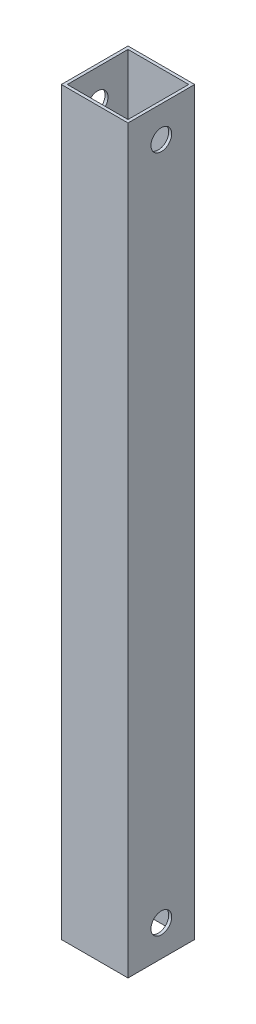
ISO-10303-21;
HEADER;
FILE_DESCRIPTION(('STEP AP214'),'2;1');
FILE_NAME('part.step','',(''),(''),'','','');
FILE_SCHEMA(('AUTOMOTIVE_DESIGN { 1 0 10303 214 1 1 1 1 }'));
ENDSEC;
DATA;
#1=APPLICATION_CONTEXT('core data for automotive mechanical design processes');
#2=APPLICATION_PROTOCOL_DEFINITION('international standard','automotive_design',2000,#1);
#3=PRODUCT_CONTEXT('',#1,'mechanical');
#4=PRODUCT('Part','Part','',(#3));
#5=PRODUCT_RELATED_PRODUCT_CATEGORY('part','',(#4));
#6=PRODUCT_DEFINITION_FORMATION('','',#4);
#7=PRODUCT_DEFINITION_CONTEXT('part definition',#1,'design');
#8=PRODUCT_DEFINITION('design','',#6,#7);
#9=PRODUCT_DEFINITION_SHAPE('','',#8);
#10=(LENGTH_UNIT() NAMED_UNIT(*) SI_UNIT(.MILLI.,.METRE.));
#11=(NAMED_UNIT(*) PLANE_ANGLE_UNIT() SI_UNIT($,.RADIAN.));
#12=(NAMED_UNIT(*) SI_UNIT($,.STERADIAN.) SOLID_ANGLE_UNIT());
#13=UNCERTAINTY_MEASURE_WITH_UNIT(LENGTH_MEASURE(1.E-05),#10,'distance_accuracy_value','');
#14=(GEOMETRIC_REPRESENTATION_CONTEXT(3) GLOBAL_UNCERTAINTY_ASSIGNED_CONTEXT((#13)) GLOBAL_UNIT_ASSIGNED_CONTEXT((#10,
#11,#12)) REPRESENTATION_CONTEXT('',''));
#15=CARTESIAN_POINT('',(0.,0.,0.));
#16=DIRECTION('',(0.,0.,1.));
#17=DIRECTION('',(1.,0.,0.));
#18=AXIS2_PLACEMENT_3D('',#15,#16,#17);
#19=CARTESIAN_POINT('',(0.,500.,0.));
#20=DIRECTION('',(1.,0.,0.));
#21=DIRECTION('',(0.,0.,-1.));
#22=AXIS2_PLACEMENT_3D('',#19,#20,#21);
#23=PLANE('',#22);
#24=CARTESIAN_POINT('',(0.,479.,-22.5));
#25=DIRECTION('',(1.,0.,0.));
#26=DIRECTION('',(0.,0.,-1.));
#27=AXIS2_PLACEMENT_3D('',#24,#25,#26);
#28=CIRCLE('',#27,7.);
#29=CARTESIAN_POINT('',(0.,479.,-29.5));
#30=VERTEX_POINT('',#29);
#31=EDGE_CURVE('E175',#30,#30,#28,.T.);
#32=ORIENTED_EDGE('',*,*,#31,.T.);
#33=EDGE_LOOP('',(#32));
#34=FACE_BOUND('',#33,.T.);
#35=CARTESIAN_POINT('',(0.,21.,-22.5));
#36=DIRECTION('',(1.,0.,0.));
#37=DIRECTION('',(0.,0.,-1.));
#38=AXIS2_PLACEMENT_3D('',#35,#36,#37);
#39=CIRCLE('',#38,7.);
#40=CARTESIAN_POINT('',(0.,21.,-29.5));
#41=VERTEX_POINT('',#40);
#42=EDGE_CURVE('E190',#41,#41,#39,.T.);
#43=ORIENTED_EDGE('',*,*,#42,.T.);
#44=EDGE_LOOP('',(#43));
#45=FACE_BOUND('',#44,.T.);
#46=DIRECTION('',(0.,0.,1.));
#47=VECTOR('',#46,1.);
#48=CARTESIAN_POINT('',(0.,0.,0.));
#49=LINE('',#48,#47);
#50=CARTESIAN_POINT('',(0.,0.,-45.));
#51=VERTEX_POINT('',#50);
#52=CARTESIAN_POINT('',(0.,0.,0.));
#53=VERTEX_POINT('',#52);
#54=EDGE_CURVE('E144',#51,#53,#49,.T.);
#55=ORIENTED_EDGE('',*,*,#54,.T.);
#56=DIRECTION('',(0.,-1.,0.));
#57=VECTOR('',#56,1.);
#58=CARTESIAN_POINT('',(0.,500.,0.));
#59=LINE('',#58,#57);
#60=CARTESIAN_POINT('',(0.,500.,0.));
#61=VERTEX_POINT('',#60);
#62=EDGE_CURVE('E11',#61,#53,#59,.T.);
#63=ORIENTED_EDGE('',*,*,#62,.F.);
#64=DIRECTION('',(0.,0.,1.));
#65=VECTOR('',#64,1.);
#66=CARTESIAN_POINT('',(0.,500.,0.));
#67=LINE('',#66,#65);
#68=CARTESIAN_POINT('',(0.,500.,-45.));
#69=VERTEX_POINT('',#68);
#70=EDGE_CURVE('E148',#69,#61,#67,.T.);
#71=ORIENTED_EDGE('',*,*,#70,.F.);
#72=DIRECTION('',(0.,-1.,0.));
#73=VECTOR('',#72,1.);
#74=CARTESIAN_POINT('',(0.,500.,-45.));
#75=LINE('',#74,#73);
#76=EDGE_CURVE('E158',#69,#51,#75,.T.);
#77=ORIENTED_EDGE('',*,*,#76,.T.);
#78=EDGE_LOOP('',(#55,#63,#71,#77));
#79=FACE_BOUND('',#78,.T.);
#80=ADVANCED_FACE('F42',(#34,#45,#79),#23,.F.);
#81=CARTESIAN_POINT('',(0.,500.,0.));
#82=DIRECTION('',(0.,0.,-1.));
#83=DIRECTION('',(-1.,0.,0.));
#84=AXIS2_PLACEMENT_3D('',#81,#82,#83);
#85=PLANE('',#84);
#86=DIRECTION('',(1.,0.,0.));
#87=VECTOR('',#86,1.);
#88=CARTESIAN_POINT('',(0.,0.,0.));
#89=LINE('',#88,#87);
#90=CARTESIAN_POINT('',(45.,0.,0.));
#91=VERTEX_POINT('',#90);
#92=EDGE_CURVE('E161',#53,#91,#89,.T.);
#93=ORIENTED_EDGE('',*,*,#92,.T.);
#94=DIRECTION('',(0.,-1.,0.));
#95=VECTOR('',#94,1.);
#96=CARTESIAN_POINT('',(45.,500.,0.));
#97=LINE('',#96,#95);
#98=CARTESIAN_POINT('',(45.,500.,0.));
#99=VERTEX_POINT('',#98);
#100=EDGE_CURVE('E50',#99,#91,#97,.T.);
#101=ORIENTED_EDGE('',*,*,#100,.F.);
#102=DIRECTION('',(1.,0.,0.));
#103=VECTOR('',#102,1.);
#104=CARTESIAN_POINT('',(0.,500.,0.));
#105=LINE('',#104,#103);
#106=EDGE_CURVE('E151',#61,#99,#105,.T.);
#107=ORIENTED_EDGE('',*,*,#106,.F.);
#108=ORIENTED_EDGE('',*,*,#62,.T.);
#109=EDGE_LOOP('',(#93,#101,#107,#108));
#110=FACE_BOUND('',#109,.T.);
#111=ADVANCED_FACE('F224',(#110),#85,.F.);
#112=CARTESIAN_POINT('',(45.,500.,0.));
#113=DIRECTION('',(-1.,0.,0.));
#114=DIRECTION('',(0.,0.,1.));
#115=AXIS2_PLACEMENT_3D('',#112,#113,#114);
#116=PLANE('',#115);
#117=CARTESIAN_POINT('',(45.,479.,-22.5));
#118=DIRECTION('',(1.,0.,0.));
#119=DIRECTION('',(0.,0.,-1.));
#120=AXIS2_PLACEMENT_3D('',#117,#118,#119);
#121=CIRCLE('',#120,7.);
#122=CARTESIAN_POINT('',(45.,479.,-29.5));
#123=VERTEX_POINT('',#122);
#124=EDGE_CURVE('E180',#123,#123,#121,.T.);
#125=ORIENTED_EDGE('',*,*,#124,.F.);
#126=EDGE_LOOP('',(#125));
#127=FACE_BOUND('',#126,.T.);
#128=CARTESIAN_POINT('',(45.,21.,-22.5));
#129=DIRECTION('',(1.,0.,0.));
#130=DIRECTION('',(0.,0.,-1.));
#131=AXIS2_PLACEMENT_3D('',#128,#129,#130);
#132=CIRCLE('',#131,7.);
#133=CARTESIAN_POINT('',(45.,21.,-29.5));
#134=VERTEX_POINT('',#133);
#135=EDGE_CURVE('E185',#134,#134,#132,.T.);
#136=ORIENTED_EDGE('',*,*,#135,.F.);
#137=EDGE_LOOP('',(#136));
#138=FACE_BOUND('',#137,.T.);
#139=DIRECTION('',(0.,0.,-1.));
#140=VECTOR('',#139,1.);
#141=CARTESIAN_POINT('',(45.,0.,0.));
#142=LINE('',#141,#140);
#143=CARTESIAN_POINT('',(45.,0.,-45.));
#144=VERTEX_POINT('',#143);
#145=EDGE_CURVE('E163',#91,#144,#142,.T.);
#146=ORIENTED_EDGE('',*,*,#145,.T.);
#147=DIRECTION('',(0.,-1.,0.));
#148=VECTOR('',#147,1.);
#149=CARTESIAN_POINT('',(45.,500.,-45.));
#150=LINE('',#149,#148);
#151=CARTESIAN_POINT('',(45.,500.,-45.));
#152=VERTEX_POINT('',#151);
#153=EDGE_CURVE('E168',#152,#144,#150,.T.);
#154=ORIENTED_EDGE('',*,*,#153,.F.);
#155=DIRECTION('',(0.,0.,-1.));
#156=VECTOR('',#155,1.);
#157=CARTESIAN_POINT('',(45.,500.,0.));
#158=LINE('',#157,#156);
#159=EDGE_CURVE('E154',#99,#152,#158,.T.);
#160=ORIENTED_EDGE('',*,*,#159,.F.);
#161=ORIENTED_EDGE('',*,*,#100,.T.);
#162=EDGE_LOOP('',(#146,#154,#160,#161));
#163=FACE_BOUND('',#162,.T.);
#164=ADVANCED_FACE('F229',(#127,#138,#163),#116,.F.);
#165=CARTESIAN_POINT('',(0.,500.,-45.));
#166=DIRECTION('',(0.,0.,1.));
#167=DIRECTION('',(1.,0.,0.));
#168=AXIS2_PLACEMENT_3D('',#165,#166,#167);
#169=PLANE('',#168);
#170=DIRECTION('',(-1.,0.,0.));
#171=VECTOR('',#170,1.);
#172=CARTESIAN_POINT('',(0.,0.,-45.));
#173=LINE('',#172,#171);
#174=EDGE_CURVE('E152',#144,#51,#173,.T.);
#175=ORIENTED_EDGE('',*,*,#174,.T.);
#176=ORIENTED_EDGE('',*,*,#76,.F.);
#177=DIRECTION('',(-1.,0.,0.));
#178=VECTOR('',#177,1.);
#179=CARTESIAN_POINT('',(0.,500.,-45.));
#180=LINE('',#179,#178);
#181=EDGE_CURVE('E156',#152,#69,#180,.T.);
#182=ORIENTED_EDGE('',*,*,#181,.F.);
#183=ORIENTED_EDGE('',*,*,#153,.T.);
#184=EDGE_LOOP('',(#175,#176,#182,#183));
#185=FACE_BOUND('',#184,.T.);
#186=ADVANCED_FACE('F234',(#185),#169,.F.);
#187=CARTESIAN_POINT('',(0.,500.,0.));
#188=DIRECTION('',(0.,-1.,0.));
#189=DIRECTION('',(0.,0.,-1.));
#190=AXIS2_PLACEMENT_3D('',#187,#188,#189);
#191=PLANE('',#190);
#192=DIRECTION('',(1.,0.,0.));
#193=VECTOR('',#192,1.);
#194=CARTESIAN_POINT('',(2.00000000000001,500.,-2.));
#195=LINE('',#194,#193);
#196=CARTESIAN_POINT('',(2.00000000000001,500.,-2.));
#197=VERTEX_POINT('',#196);
#198=CARTESIAN_POINT('',(43.,500.,-2.));
#199=VERTEX_POINT('',#198);
#200=EDGE_CURVE('E138',#197,#199,#195,.T.);
#201=ORIENTED_EDGE('',*,*,#200,.F.);
#202=DIRECTION('',(0.,0.,1.));
#203=VECTOR('',#202,1.);
#204=CARTESIAN_POINT('',(2.,500.,-43.));
#205=LINE('',#204,#203);
#206=CARTESIAN_POINT('',(2.,500.,-43.));
#207=VERTEX_POINT('',#206);
#208=EDGE_CURVE('E58',#207,#197,#205,.T.);
#209=ORIENTED_EDGE('',*,*,#208,.F.);
#210=DIRECTION('',(-1.,0.,0.));
#211=VECTOR('',#210,1.);
#212=CARTESIAN_POINT('',(2.,500.,-43.));
#213=LINE('',#212,#211);
#214=CARTESIAN_POINT('',(43.,500.,-43.));
#215=VERTEX_POINT('',#214);
#216=EDGE_CURVE('E126',#215,#207,#213,.T.);
#217=ORIENTED_EDGE('',*,*,#216,.F.);
#218=DIRECTION('',(0.,0.,-1.));
#219=VECTOR('',#218,1.);
#220=CARTESIAN_POINT('',(43.,500.,-43.));
#221=LINE('',#220,#219);
#222=EDGE_CURVE('E129',#199,#215,#221,.T.);
#223=ORIENTED_EDGE('',*,*,#222,.F.);
#224=EDGE_LOOP('',(#201,#209,#217,#223));
#225=FACE_BOUND('',#224,.T.);
#226=ORIENTED_EDGE('',*,*,#70,.T.);
#227=ORIENTED_EDGE('',*,*,#106,.T.);
#228=ORIENTED_EDGE('',*,*,#159,.T.);
#229=ORIENTED_EDGE('',*,*,#181,.T.);
#230=EDGE_LOOP('',(#226,#227,#228,#229));
#231=FACE_BOUND('',#230,.T.);
#232=ADVANCED_FACE('F218',(#225,#231),#191,.F.);
#233=CARTESIAN_POINT('',(0.,0.,0.));
#234=DIRECTION('',(0.,-1.,0.));
#235=DIRECTION('',(0.,0.,-1.));
#236=AXIS2_PLACEMENT_3D('',#233,#234,#235);
#237=PLANE('',#236);
#238=DIRECTION('',(0.,0.,1.));
#239=VECTOR('',#238,1.);
#240=CARTESIAN_POINT('',(2.,0.,-43.));
#241=LINE('',#240,#239);
#242=CARTESIAN_POINT('',(2.,0.,-43.));
#243=VERTEX_POINT('',#242);
#244=CARTESIAN_POINT('',(2.00000000000001,0.,-2.));
#245=VERTEX_POINT('',#244);
#246=EDGE_CURVE('E110',#243,#245,#241,.T.);
#247=ORIENTED_EDGE('',*,*,#246,.T.);
#248=DIRECTION('',(1.,0.,0.));
#249=VECTOR('',#248,1.);
#250=CARTESIAN_POINT('',(2.00000000000001,0.,-2.));
#251=LINE('',#250,#249);
#252=CARTESIAN_POINT('',(43.,0.,-2.));
#253=VERTEX_POINT('',#252);
#254=EDGE_CURVE('E119',#245,#253,#251,.T.);
#255=ORIENTED_EDGE('',*,*,#254,.T.);
#256=DIRECTION('',(0.,0.,-1.));
#257=VECTOR('',#256,1.);
#258=CARTESIAN_POINT('',(43.,0.,-43.));
#259=LINE('',#258,#257);
#260=CARTESIAN_POINT('',(43.,0.,-43.));
#261=VERTEX_POINT('',#260);
#262=EDGE_CURVE('E66',#253,#261,#259,.T.);
#263=ORIENTED_EDGE('',*,*,#262,.T.);
#264=DIRECTION('',(-1.,0.,0.));
#265=VECTOR('',#264,1.);
#266=CARTESIAN_POINT('',(2.,0.,-43.));
#267=LINE('',#266,#265);
#268=EDGE_CURVE('E116',#261,#243,#267,.T.);
#269=ORIENTED_EDGE('',*,*,#268,.T.);
#270=EDGE_LOOP('',(#247,#255,#263,#269));
#271=FACE_BOUND('',#270,.T.);
#272=ORIENTED_EDGE('',*,*,#54,.F.);
#273=ORIENTED_EDGE('',*,*,#174,.F.);
#274=ORIENTED_EDGE('',*,*,#145,.F.);
#275=ORIENTED_EDGE('',*,*,#92,.F.);
#276=EDGE_LOOP('',(#272,#273,#274,#275));
#277=FACE_BOUND('',#276,.T.);
#278=ADVANCED_FACE('F123',(#271,#277),#237,.T.);
#279=CARTESIAN_POINT('',(2.,0.,-43.));
#280=DIRECTION('',(-1.,0.,0.));
#281=DIRECTION('',(0.,0.,1.));
#282=AXIS2_PLACEMENT_3D('',#279,#280,#281);
#283=PLANE('',#282);
#284=CARTESIAN_POINT('',(2.,479.,-22.5));
#285=DIRECTION('',(-1.,0.,0.));
#286=DIRECTION('',(0.,0.,1.));
#287=AXIS2_PLACEMENT_3D('',#284,#285,#286);
#288=CIRCLE('',#287,7.);
#289=CARTESIAN_POINT('',(2.,479.,-29.5));
#290=VERTEX_POINT('',#289);
#291=EDGE_CURVE('E132',#290,#290,#288,.T.);
#292=ORIENTED_EDGE('',*,*,#291,.T.);
#293=EDGE_LOOP('',(#292));
#294=FACE_BOUND('',#293,.T.);
#295=CARTESIAN_POINT('',(2.,21.,-22.5));
#296=DIRECTION('',(-1.,0.,0.));
#297=DIRECTION('',(0.,0.,1.));
#298=AXIS2_PLACEMENT_3D('',#295,#296,#297);
#299=CIRCLE('',#298,7.);
#300=CARTESIAN_POINT('',(2.,21.,-29.5));
#301=VERTEX_POINT('',#300);
#302=EDGE_CURVE('E174',#301,#301,#299,.T.);
#303=ORIENTED_EDGE('',*,*,#302,.T.);
#304=EDGE_LOOP('',(#303));
#305=FACE_BOUND('',#304,.T.);
#306=ORIENTED_EDGE('',*,*,#208,.T.);
#307=DIRECTION('',(0.,1.,0.));
#308=VECTOR('',#307,1.);
#309=CARTESIAN_POINT('',(2.00000000000001,0.,-2.));
#310=LINE('',#309,#308);
#311=EDGE_CURVE('E106',#245,#197,#310,.T.);
#312=ORIENTED_EDGE('',*,*,#311,.F.);
#313=ORIENTED_EDGE('',*,*,#246,.F.);
#314=DIRECTION('',(0.,1.,0.));
#315=VECTOR('',#314,1.);
#316=CARTESIAN_POINT('',(2.,0.,-43.));
#317=LINE('',#316,#315);
#318=EDGE_CURVE('E142',#243,#207,#317,.T.);
#319=ORIENTED_EDGE('',*,*,#318,.T.);
#320=EDGE_LOOP('',(#306,#312,#313,#319));
#321=FACE_BOUND('',#320,.T.);
#322=ADVANCED_FACE('F108',(#294,#305,#321),#283,.F.);
#323=CARTESIAN_POINT('',(2.,0.,-43.));
#324=DIRECTION('',(0.,0.,-1.));
#325=DIRECTION('',(-1.,0.,0.));
#326=AXIS2_PLACEMENT_3D('',#323,#324,#325);
#327=PLANE('',#326);
#328=ORIENTED_EDGE('',*,*,#216,.T.);
#329=ORIENTED_EDGE('',*,*,#318,.F.);
#330=ORIENTED_EDGE('',*,*,#268,.F.);
#331=DIRECTION('',(0.,1.,0.));
#332=VECTOR('',#331,1.);
#333=CARTESIAN_POINT('',(43.,0.,-43.));
#334=LINE('',#333,#332);
#335=EDGE_CURVE('E145',#261,#215,#334,.T.);
#336=ORIENTED_EDGE('',*,*,#335,.T.);
#337=EDGE_LOOP('',(#328,#329,#330,#336));
#338=FACE_BOUND('',#337,.T.);
#339=ADVANCED_FACE('F206',(#338),#327,.F.);
#340=CARTESIAN_POINT('',(43.,0.,-43.));
#341=DIRECTION('',(1.,0.,0.));
#342=DIRECTION('',(0.,0.,-1.));
#343=AXIS2_PLACEMENT_3D('',#340,#341,#342);
#344=PLANE('',#343);
#345=CARTESIAN_POINT('',(43.,479.,-22.5));
#346=DIRECTION('',(1.,0.,0.));
#347=DIRECTION('',(0.,0.,-1.));
#348=AXIS2_PLACEMENT_3D('',#345,#346,#347);
#349=CIRCLE('',#348,7.);
#350=CARTESIAN_POINT('',(43.,479.,-29.5));
#351=VERTEX_POINT('',#350);
#352=EDGE_CURVE('E45',#351,#351,#349,.T.);
#353=ORIENTED_EDGE('',*,*,#352,.T.);
#354=EDGE_LOOP('',(#353));
#355=FACE_BOUND('',#354,.T.);
#356=CARTESIAN_POINT('',(43.,21.,-22.5));
#357=DIRECTION('',(1.,0.,0.));
#358=DIRECTION('',(0.,0.,-1.));
#359=AXIS2_PLACEMENT_3D('',#356,#357,#358);
#360=CIRCLE('',#359,7.);
#361=CARTESIAN_POINT('',(43.,21.,-29.5));
#362=VERTEX_POINT('',#361);
#363=EDGE_CURVE('E172',#362,#362,#360,.T.);
#364=ORIENTED_EDGE('',*,*,#363,.T.);
#365=EDGE_LOOP('',(#364));
#366=FACE_BOUND('',#365,.T.);
#367=ORIENTED_EDGE('',*,*,#222,.T.);
#368=ORIENTED_EDGE('',*,*,#335,.F.);
#369=ORIENTED_EDGE('',*,*,#262,.F.);
#370=DIRECTION('',(0.,1.,0.));
#371=VECTOR('',#370,1.);
#372=CARTESIAN_POINT('',(43.,0.,-2.));
#373=LINE('',#372,#371);
#374=EDGE_CURVE('E115',#253,#199,#373,.T.);
#375=ORIENTED_EDGE('',*,*,#374,.T.);
#376=EDGE_LOOP('',(#367,#368,#369,#375));
#377=FACE_BOUND('',#376,.T.);
#378=ADVANCED_FACE('F214',(#355,#366,#377),#344,.F.);
#379=CARTESIAN_POINT('',(2.00000000000001,0.,-2.));
#380=DIRECTION('',(0.,0.,1.));
#381=DIRECTION('',(1.,0.,0.));
#382=AXIS2_PLACEMENT_3D('',#379,#380,#381);
#383=PLANE('',#382);
#384=ORIENTED_EDGE('',*,*,#200,.T.);
#385=ORIENTED_EDGE('',*,*,#374,.F.);
#386=ORIENTED_EDGE('',*,*,#254,.F.);
#387=ORIENTED_EDGE('',*,*,#311,.T.);
#388=EDGE_LOOP('',(#384,#385,#386,#387));
#389=FACE_BOUND('',#388,.T.);
#390=ADVANCED_FACE('F120',(#389),#383,.F.);
#391=CARTESIAN_POINT('',(0.,21.,-22.5));
#392=DIRECTION('',(1.,0.,0.));
#393=DIRECTION('',(0.,0.,-1.));
#394=AXIS2_PLACEMENT_3D('',#391,#392,#393);
#395=CYLINDRICAL_SURFACE('',#394,7.);
#396=CARTESIAN_POINT('',(45.,21.,-29.5));
#397=CARTESIAN_POINT('',(44.9791666666667,21.,-29.5));
#398=CARTESIAN_POINT('',(44.9583333333333,21.,-29.5));
#399=CARTESIAN_POINT('',(44.9166666666667,21.,-29.5));
#400=CARTESIAN_POINT('',(44.8958333333333,21.,-29.5));
#401=CARTESIAN_POINT('',(44.8541666666667,21.,-29.5));
#402=CARTESIAN_POINT('',(44.8333333333333,21.,-29.5));
#403=CARTESIAN_POINT('',(44.7916666666667,21.,-29.5));
#404=CARTESIAN_POINT('',(44.7708333333333,21.,-29.5));
#405=CARTESIAN_POINT('',(44.7291666666667,21.,-29.5));
#406=CARTESIAN_POINT('',(44.7083333333333,21.,-29.5));
#407=CARTESIAN_POINT('',(44.6666666666667,21.,-29.5));
#408=CARTESIAN_POINT('',(44.6458333333333,21.,-29.5));
#409=CARTESIAN_POINT('',(44.6041666666667,21.,-29.5));
#410=CARTESIAN_POINT('',(44.5833333333333,21.,-29.5));
#411=CARTESIAN_POINT('',(44.5416666666667,21.,-29.5));
#412=CARTESIAN_POINT('',(44.5208333333333,21.,-29.5));
#413=CARTESIAN_POINT('',(44.4791666666667,21.,-29.5));
#414=CARTESIAN_POINT('',(44.4583333333333,21.,-29.5));
#415=CARTESIAN_POINT('',(44.4166666666667,21.,-29.5));
#416=CARTESIAN_POINT('',(44.3958333333333,21.,-29.5));
#417=CARTESIAN_POINT('',(44.3541666666667,21.,-29.5));
#418=CARTESIAN_POINT('',(44.3333333333333,21.,-29.5));
#419=CARTESIAN_POINT('',(44.2916666666667,21.,-29.5));
#420=CARTESIAN_POINT('',(44.2708333333333,21.,-29.5));
#421=CARTESIAN_POINT('',(44.2291666666667,21.,-29.5));
#422=CARTESIAN_POINT('',(44.2083333333333,21.,-29.5));
#423=CARTESIAN_POINT('',(44.1666666666667,21.,-29.5));
#424=CARTESIAN_POINT('',(44.1458333333333,21.,-29.5));
#425=CARTESIAN_POINT('',(44.1041666666667,21.,-29.5));
#426=CARTESIAN_POINT('',(44.0833333333333,21.,-29.5));
#427=CARTESIAN_POINT('',(44.0416666666667,21.,-29.5));
#428=CARTESIAN_POINT('',(44.0208333333333,21.,-29.5));
#429=CARTESIAN_POINT('',(43.9791666666667,21.,-29.5));
#430=CARTESIAN_POINT('',(43.9583333333333,21.,-29.5));
#431=CARTESIAN_POINT('',(43.9166666666667,21.,-29.5));
#432=CARTESIAN_POINT('',(43.8958333333333,21.,-29.5));
#433=CARTESIAN_POINT('',(43.8541666666667,21.,-29.5));
#434=CARTESIAN_POINT('',(43.8333333333333,21.,-29.5));
#435=CARTESIAN_POINT('',(43.7916666666667,21.,-29.5));
#436=CARTESIAN_POINT('',(43.7708333333333,21.,-29.5));
#437=CARTESIAN_POINT('',(43.7291666666667,21.,-29.5));
#438=CARTESIAN_POINT('',(43.7083333333333,21.,-29.5));
#439=CARTESIAN_POINT('',(43.6666666666667,21.,-29.5));
#440=CARTESIAN_POINT('',(43.6458333333333,21.,-29.5));
#441=CARTESIAN_POINT('',(43.6041666666667,21.,-29.5));
#442=CARTESIAN_POINT('',(43.5833333333333,21.,-29.5));
#443=CARTESIAN_POINT('',(43.5416666666667,21.,-29.5));
#444=CARTESIAN_POINT('',(43.5208333333333,21.,-29.5));
#445=CARTESIAN_POINT('',(43.4791666666667,21.,-29.5));
#446=CARTESIAN_POINT('',(43.4583333333333,21.,-29.5));
#447=CARTESIAN_POINT('',(43.4166666666667,21.,-29.5));
#448=CARTESIAN_POINT('',(43.3958333333333,21.,-29.5));
#449=CARTESIAN_POINT('',(43.3541666666667,21.,-29.5));
#450=CARTESIAN_POINT('',(43.3333333333333,21.,-29.5));
#451=CARTESIAN_POINT('',(43.2916666666667,21.,-29.5));
#452=CARTESIAN_POINT('',(43.2708333333333,21.,-29.5));
#453=CARTESIAN_POINT('',(43.2291666666667,21.,-29.5));
#454=CARTESIAN_POINT('',(43.2083333333333,21.,-29.5));
#455=CARTESIAN_POINT('',(43.1666666666667,21.,-29.5));
#456=CARTESIAN_POINT('',(43.1458333333333,21.,-29.5));
#457=CARTESIAN_POINT('',(43.1041666666667,21.,-29.5));
#458=CARTESIAN_POINT('',(43.0833333333333,21.,-29.5));
#459=CARTESIAN_POINT('',(43.0416666666667,21.,-29.5));
#460=CARTESIAN_POINT('',(43.0208333333333,21.,-29.5));
#461=CARTESIAN_POINT('',(43.,21.,-29.5));
#462=B_SPLINE_CURVE_WITH_KNOTS('',3,(#396,#397,#398,#399,#400,#401,#402,#403,#404,#405,#406,
#407,#408,#409,#410,#411,#412,#413,#414,#415,#416,#417,#418,#419,#420,#421,#422,#423,#424,#425,
#426,#427,#428,#429,#430,#431,#432,#433,#434,#435,#436,#437,#438,#439,#440,#441,#442,#443,#444,
#445,#446,#447,#448,#449,#450,#451,#452,#453,#454,#455,#456,#457,#458,#459,#460,#461),
.UNSPECIFIED.,.F.,.F.,(4,2,2,2,2,2,2,2,2,2,2,2,2,2,2,2,2,2,2,2,2,2,2,2,2,2,2,2,2,2,2,2,4),(0.,
0.0625000000000001,0.125,0.1875,0.25,0.3125,0.375,0.4375,0.5,0.562499999999994,
0.624999999999994,0.687499999999994,0.749999999999994,0.812499999999994,0.874999999999994,
0.937499999999994,0.999999999999994,1.06249999999999,1.12499999999999,1.18749999999999,
1.24999999999999,1.31249999999999,1.37499999999999,1.43749999999999,1.49999999999999,
1.56249999999999,1.62499999999999,1.68749999999999,1.74999999999999,1.81249999999999,
1.87499999999999,1.93749999999999,1.99999999999999),.UNSPECIFIED.);
#463=EDGE_CURVE('BSEAM202',#134,#362,#462,.T.);
#464=ORIENTED_EDGE('',*,*,#135,.T.);
#465=ORIENTED_EDGE('',*,*,#363,.F.);
#466=ORIENTED_EDGE('',*,*,#463,.T.);
#467=ORIENTED_EDGE('',*,*,#463,.F.);
#468=EDGE_LOOP('',(#464,#466,#465,#467));
#469=FACE_BOUND('',#468,.T.);
#470=ADVANCED_FACE('F202',(#469),#395,.F.);
#471=CARTESIAN_POINT('',(0.,479.,-22.5));
#472=DIRECTION('',(1.,0.,0.));
#473=DIRECTION('',(0.,0.,-1.));
#474=AXIS2_PLACEMENT_3D('',#471,#472,#473);
#475=CYLINDRICAL_SURFACE('',#474,7.);
#476=CARTESIAN_POINT('',(45.,479.,-29.5));
#477=CARTESIAN_POINT('',(44.9791666666667,479.,-29.5));
#478=CARTESIAN_POINT('',(44.9583333333333,479.,-29.5));
#479=CARTESIAN_POINT('',(44.9166666666667,479.,-29.5));
#480=CARTESIAN_POINT('',(44.8958333333333,479.,-29.5));
#481=CARTESIAN_POINT('',(44.8541666666667,479.,-29.5));
#482=CARTESIAN_POINT('',(44.8333333333333,479.,-29.5));
#483=CARTESIAN_POINT('',(44.7916666666667,479.,-29.5));
#484=CARTESIAN_POINT('',(44.7708333333333,479.,-29.5));
#485=CARTESIAN_POINT('',(44.7291666666667,479.,-29.5));
#486=CARTESIAN_POINT('',(44.7083333333333,479.,-29.5));
#487=CARTESIAN_POINT('',(44.6666666666667,479.,-29.5));
#488=CARTESIAN_POINT('',(44.6458333333333,479.,-29.5));
#489=CARTESIAN_POINT('',(44.6041666666667,479.,-29.5));
#490=CARTESIAN_POINT('',(44.5833333333333,479.,-29.5));
#491=CARTESIAN_POINT('',(44.5416666666667,479.,-29.5));
#492=CARTESIAN_POINT('',(44.5208333333333,479.,-29.5));
#493=CARTESIAN_POINT('',(44.4791666666667,479.,-29.5));
#494=CARTESIAN_POINT('',(44.4583333333333,479.,-29.5));
#495=CARTESIAN_POINT('',(44.4166666666667,479.,-29.5));
#496=CARTESIAN_POINT('',(44.3958333333333,479.,-29.5));
#497=CARTESIAN_POINT('',(44.3541666666667,479.,-29.5));
#498=CARTESIAN_POINT('',(44.3333333333333,479.,-29.5));
#499=CARTESIAN_POINT('',(44.2916666666667,479.,-29.5));
#500=CARTESIAN_POINT('',(44.2708333333333,479.,-29.5));
#501=CARTESIAN_POINT('',(44.2291666666667,479.,-29.5));
#502=CARTESIAN_POINT('',(44.2083333333333,479.,-29.5));
#503=CARTESIAN_POINT('',(44.1666666666667,479.,-29.5));
#504=CARTESIAN_POINT('',(44.1458333333333,479.,-29.5));
#505=CARTESIAN_POINT('',(44.1041666666667,479.,-29.5));
#506=CARTESIAN_POINT('',(44.0833333333333,479.,-29.5));
#507=CARTESIAN_POINT('',(44.0416666666667,479.,-29.5));
#508=CARTESIAN_POINT('',(44.0208333333333,479.,-29.5));
#509=CARTESIAN_POINT('',(43.9791666666667,479.,-29.5));
#510=CARTESIAN_POINT('',(43.9583333333333,479.,-29.5));
#511=CARTESIAN_POINT('',(43.9166666666667,479.,-29.5));
#512=CARTESIAN_POINT('',(43.8958333333333,479.,-29.5));
#513=CARTESIAN_POINT('',(43.8541666666667,479.,-29.5));
#514=CARTESIAN_POINT('',(43.8333333333333,479.,-29.5));
#515=CARTESIAN_POINT('',(43.7916666666667,479.,-29.5));
#516=CARTESIAN_POINT('',(43.7708333333333,479.,-29.5));
#517=CARTESIAN_POINT('',(43.7291666666667,479.,-29.5));
#518=CARTESIAN_POINT('',(43.7083333333333,479.,-29.5));
#519=CARTESIAN_POINT('',(43.6666666666667,479.,-29.5));
#520=CARTESIAN_POINT('',(43.6458333333333,479.,-29.5));
#521=CARTESIAN_POINT('',(43.6041666666667,479.,-29.5));
#522=CARTESIAN_POINT('',(43.5833333333333,479.,-29.5));
#523=CARTESIAN_POINT('',(43.5416666666667,479.,-29.5));
#524=CARTESIAN_POINT('',(43.5208333333333,479.,-29.5));
#525=CARTESIAN_POINT('',(43.4791666666667,479.,-29.5));
#526=CARTESIAN_POINT('',(43.4583333333333,479.,-29.5));
#527=CARTESIAN_POINT('',(43.4166666666667,479.,-29.5));
#528=CARTESIAN_POINT('',(43.3958333333333,479.,-29.5));
#529=CARTESIAN_POINT('',(43.3541666666667,479.,-29.5));
#530=CARTESIAN_POINT('',(43.3333333333333,479.,-29.5));
#531=CARTESIAN_POINT('',(43.2916666666667,479.,-29.5));
#532=CARTESIAN_POINT('',(43.2708333333333,479.,-29.5));
#533=CARTESIAN_POINT('',(43.2291666666667,479.,-29.5));
#534=CARTESIAN_POINT('',(43.2083333333333,479.,-29.5));
#535=CARTESIAN_POINT('',(43.1666666666667,479.,-29.5));
#536=CARTESIAN_POINT('',(43.1458333333333,479.,-29.5));
#537=CARTESIAN_POINT('',(43.1041666666667,479.,-29.5));
#538=CARTESIAN_POINT('',(43.0833333333333,479.,-29.5));
#539=CARTESIAN_POINT('',(43.0416666666667,479.,-29.5));
#540=CARTESIAN_POINT('',(43.0208333333333,479.,-29.5));
#541=CARTESIAN_POINT('',(43.,479.,-29.5));
#542=B_SPLINE_CURVE_WITH_KNOTS('',3,(#476,#477,#478,#479,#480,#481,#482,#483,#484,#485,#486,
#487,#488,#489,#490,#491,#492,#493,#494,#495,#496,#497,#498,#499,#500,#501,#502,#503,#504,#505,
#506,#507,#508,#509,#510,#511,#512,#513,#514,#515,#516,#517,#518,#519,#520,#521,#522,#523,#524,
#525,#526,#527,#528,#529,#530,#531,#532,#533,#534,#535,#536,#537,#538,#539,#540,#541),
.UNSPECIFIED.,.F.,.F.,(4,2,2,2,2,2,2,2,2,2,2,2,2,2,2,2,2,2,2,2,2,2,2,2,2,2,2,2,2,2,2,2,4),(0.,
0.0625000000000001,0.125,0.1875,0.25,0.3125,0.375,0.4375,0.5,0.562499999999994,
0.624999999999994,0.687499999999994,0.749999999999994,0.812499999999994,0.874999999999994,
0.937499999999994,0.999999999999994,1.06249999999999,1.12499999999999,1.18749999999999,
1.24999999999999,1.31249999999999,1.37499999999999,1.43749999999999,1.49999999999999,
1.56249999999999,1.62499999999999,1.68749999999999,1.74999999999999,1.81249999999999,
1.87499999999999,1.93749999999999,1.99999999999999),.UNSPECIFIED.);
#543=EDGE_CURVE('BSEAM200',#123,#351,#542,.T.);
#544=ORIENTED_EDGE('',*,*,#124,.T.);
#545=ORIENTED_EDGE('',*,*,#352,.F.);
#546=ORIENTED_EDGE('',*,*,#543,.T.);
#547=ORIENTED_EDGE('',*,*,#543,.F.);
#548=EDGE_LOOP('',(#544,#546,#545,#547));
#549=FACE_BOUND('',#548,.T.);
#550=ADVANCED_FACE('F200',(#549),#475,.F.);
#551=CARTESIAN_POINT('',(0.,21.,-29.5));
#552=CARTESIAN_POINT('',(0.0208333333333334,21.,-29.5));
#553=CARTESIAN_POINT('',(0.0416666666666667,21.,-29.5));
#554=CARTESIAN_POINT('',(0.0833333333333334,21.,-29.5));
#555=CARTESIAN_POINT('',(0.104166666666667,21.,-29.5));
#556=CARTESIAN_POINT('',(0.145833333333333,21.,-29.5));
#557=CARTESIAN_POINT('',(0.166666666666667,21.,-29.5));
#558=CARTESIAN_POINT('',(0.208333333333333,21.,-29.5));
#559=CARTESIAN_POINT('',(0.229166666666667,21.,-29.5));
#560=CARTESIAN_POINT('',(0.270833333333334,21.,-29.5));
#561=CARTESIAN_POINT('',(0.291666666666667,21.,-29.5));
#562=CARTESIAN_POINT('',(0.333333333333334,21.,-29.5));
#563=CARTESIAN_POINT('',(0.354166666666667,21.,-29.5));
#564=CARTESIAN_POINT('',(0.395833333333334,21.,-29.5));
#565=CARTESIAN_POINT('',(0.416666666666667,21.,-29.5));
#566=CARTESIAN_POINT('',(0.458333333333334,21.,-29.5));
#567=CARTESIAN_POINT('',(0.479166666666667,21.,-29.5));
#568=CARTESIAN_POINT('',(0.520833333333334,21.,-29.5));
#569=CARTESIAN_POINT('',(0.541666666666667,21.,-29.5));
#570=CARTESIAN_POINT('',(0.583333333333334,21.,-29.5));
#571=CARTESIAN_POINT('',(0.604166666666667,21.,-29.5));
#572=CARTESIAN_POINT('',(0.645833333333334,21.,-29.5));
#573=CARTESIAN_POINT('',(0.666666666666667,21.,-29.5));
#574=CARTESIAN_POINT('',(0.708333333333334,21.,-29.5));
#575=CARTESIAN_POINT('',(0.729166666666667,21.,-29.5));
#576=CARTESIAN_POINT('',(0.770833333333334,21.,-29.5));
#577=CARTESIAN_POINT('',(0.791666666666667,21.,-29.5));
#578=CARTESIAN_POINT('',(0.833333333333334,21.,-29.5));
#579=CARTESIAN_POINT('',(0.854166666666667,21.,-29.5));
#580=CARTESIAN_POINT('',(0.895833333333334,21.,-29.5));
#581=CARTESIAN_POINT('',(0.916666666666667,21.,-29.5));
#582=CARTESIAN_POINT('',(0.958333333333334,21.,-29.5));
#583=CARTESIAN_POINT('',(0.979166666666667,21.,-29.5));
#584=CARTESIAN_POINT('',(1.02083333333333,21.,-29.5));
#585=CARTESIAN_POINT('',(1.04166666666667,21.,-29.5));
#586=CARTESIAN_POINT('',(1.08333333333333,21.,-29.5));
#587=CARTESIAN_POINT('',(1.10416666666667,21.,-29.5));
#588=CARTESIAN_POINT('',(1.14583333333333,21.,-29.5));
#589=CARTESIAN_POINT('',(1.16666666666667,21.,-29.5));
#590=CARTESIAN_POINT('',(1.20833333333333,21.,-29.5));
#591=CARTESIAN_POINT('',(1.22916666666667,21.,-29.5));
#592=CARTESIAN_POINT('',(1.27083333333333,21.,-29.5));
#593=CARTESIAN_POINT('',(1.29166666666667,21.,-29.5));
#594=CARTESIAN_POINT('',(1.33333333333333,21.,-29.5));
#595=CARTESIAN_POINT('',(1.35416666666667,21.,-29.5));
#596=CARTESIAN_POINT('',(1.39583333333333,21.,-29.5));
#597=CARTESIAN_POINT('',(1.41666666666667,21.,-29.5));
#598=CARTESIAN_POINT('',(1.45833333333333,21.,-29.5));
#599=CARTESIAN_POINT('',(1.47916666666667,21.,-29.5));
#600=CARTESIAN_POINT('',(1.52083333333333,21.,-29.5));
#601=CARTESIAN_POINT('',(1.54166666666667,21.,-29.5));
#602=CARTESIAN_POINT('',(1.58333333333333,21.,-29.5));
#603=CARTESIAN_POINT('',(1.60416666666667,21.,-29.5));
#604=CARTESIAN_POINT('',(1.64583333333333,21.,-29.5));
#605=CARTESIAN_POINT('',(1.66666666666667,21.,-29.5));
#606=CARTESIAN_POINT('',(1.70833333333333,21.,-29.5));
#607=CARTESIAN_POINT('',(1.72916666666667,21.,-29.5));
#608=CARTESIAN_POINT('',(1.77083333333333,21.,-29.5));
#609=CARTESIAN_POINT('',(1.79166666666667,21.,-29.5));
#610=CARTESIAN_POINT('',(1.83333333333333,21.,-29.5));
#611=CARTESIAN_POINT('',(1.85416666666667,21.,-29.5));
#612=CARTESIAN_POINT('',(1.89583333333333,21.,-29.5));
#613=CARTESIAN_POINT('',(1.91666666666667,21.,-29.5));
#614=CARTESIAN_POINT('',(1.95833333333334,21.,-29.5));
#615=CARTESIAN_POINT('',(1.97916666666667,21.,-29.5));
#616=CARTESIAN_POINT('',(2.,21.,-29.5));
#617=B_SPLINE_CURVE_WITH_KNOTS('',3,(#551,#552,#553,#554,#555,#556,#557,#558,#559,#560,#561,
#562,#563,#564,#565,#566,#567,#568,#569,#570,#571,#572,#573,#574,#575,#576,#577,#578,#579,#580,
#581,#582,#583,#584,#585,#586,#587,#588,#589,#590,#591,#592,#593,#594,#595,#596,#597,#598,#599,
#600,#601,#602,#603,#604,#605,#606,#607,#608,#609,#610,#611,#612,#613,#614,#615,#616),
.UNSPECIFIED.,.F.,.F.,(4,2,2,2,2,2,2,2,2,2,2,2,2,2,2,2,2,2,2,2,2,2,2,2,2,2,2,2,2,2,2,2,4),(0.,
0.0625,0.125,0.1875,0.25,0.3125,0.375,0.4375,0.5,0.5625,0.625,0.687500000000001,
0.750000000000001,0.812500000000001,0.875000000000001,0.937500000000001,1.,1.0625,1.125,1.1875,
1.25,1.3125,1.375,1.4375,1.5,1.5625,1.625,1.6875,1.75,1.8125,1.875,1.9375,2.),.UNSPECIFIED.);
#618=EDGE_CURVE('BSEAM196',#41,#301,#617,.T.);
#619=ORIENTED_EDGE('',*,*,#42,.F.);
#620=ORIENTED_EDGE('',*,*,#302,.F.);
#621=ORIENTED_EDGE('',*,*,#618,.T.);
#622=ORIENTED_EDGE('',*,*,#618,.F.);
#623=EDGE_LOOP('',(#619,#621,#620,#622));
#624=FACE_BOUND('',#623,.T.);
#625=ADVANCED_FACE('F196',(#624),#395,.F.);
#626=CARTESIAN_POINT('',(0.,479.,-29.5));
#627=CARTESIAN_POINT('',(0.0208333333333334,479.,-29.5));
#628=CARTESIAN_POINT('',(0.0416666666666667,479.,-29.5));
#629=CARTESIAN_POINT('',(0.0833333333333334,479.,-29.5));
#630=CARTESIAN_POINT('',(0.104166666666667,479.,-29.5));
#631=CARTESIAN_POINT('',(0.145833333333333,479.,-29.5));
#632=CARTESIAN_POINT('',(0.166666666666667,479.,-29.5));
#633=CARTESIAN_POINT('',(0.208333333333333,479.,-29.5));
#634=CARTESIAN_POINT('',(0.229166666666667,479.,-29.5));
#635=CARTESIAN_POINT('',(0.270833333333334,479.,-29.5));
#636=CARTESIAN_POINT('',(0.291666666666667,479.,-29.5));
#637=CARTESIAN_POINT('',(0.333333333333334,479.,-29.5));
#638=CARTESIAN_POINT('',(0.354166666666667,479.,-29.5));
#639=CARTESIAN_POINT('',(0.395833333333334,479.,-29.5));
#640=CARTESIAN_POINT('',(0.416666666666667,479.,-29.5));
#641=CARTESIAN_POINT('',(0.458333333333334,479.,-29.5));
#642=CARTESIAN_POINT('',(0.479166666666667,479.,-29.5));
#643=CARTESIAN_POINT('',(0.520833333333334,479.,-29.5));
#644=CARTESIAN_POINT('',(0.541666666666667,479.,-29.5));
#645=CARTESIAN_POINT('',(0.583333333333334,479.,-29.5));
#646=CARTESIAN_POINT('',(0.604166666666667,479.,-29.5));
#647=CARTESIAN_POINT('',(0.645833333333334,479.,-29.5));
#648=CARTESIAN_POINT('',(0.666666666666667,479.,-29.5));
#649=CARTESIAN_POINT('',(0.708333333333334,479.,-29.5));
#650=CARTESIAN_POINT('',(0.729166666666667,479.,-29.5));
#651=CARTESIAN_POINT('',(0.770833333333334,479.,-29.5));
#652=CARTESIAN_POINT('',(0.791666666666667,479.,-29.5));
#653=CARTESIAN_POINT('',(0.833333333333334,479.,-29.5));
#654=CARTESIAN_POINT('',(0.854166666666667,479.,-29.5));
#655=CARTESIAN_POINT('',(0.895833333333334,479.,-29.5));
#656=CARTESIAN_POINT('',(0.916666666666667,479.,-29.5));
#657=CARTESIAN_POINT('',(0.958333333333334,479.,-29.5));
#658=CARTESIAN_POINT('',(0.979166666666667,479.,-29.5));
#659=CARTESIAN_POINT('',(1.02083333333333,479.,-29.5));
#660=CARTESIAN_POINT('',(1.04166666666667,479.,-29.5));
#661=CARTESIAN_POINT('',(1.08333333333333,479.,-29.5));
#662=CARTESIAN_POINT('',(1.10416666666667,479.,-29.5));
#663=CARTESIAN_POINT('',(1.14583333333333,479.,-29.5));
#664=CARTESIAN_POINT('',(1.16666666666667,479.,-29.5));
#665=CARTESIAN_POINT('',(1.20833333333333,479.,-29.5));
#666=CARTESIAN_POINT('',(1.22916666666667,479.,-29.5));
#667=CARTESIAN_POINT('',(1.27083333333333,479.,-29.5));
#668=CARTESIAN_POINT('',(1.29166666666667,479.,-29.5));
#669=CARTESIAN_POINT('',(1.33333333333333,479.,-29.5));
#670=CARTESIAN_POINT('',(1.35416666666667,479.,-29.5));
#671=CARTESIAN_POINT('',(1.39583333333333,479.,-29.5));
#672=CARTESIAN_POINT('',(1.41666666666667,479.,-29.5));
#673=CARTESIAN_POINT('',(1.45833333333333,479.,-29.5));
#674=CARTESIAN_POINT('',(1.47916666666667,479.,-29.5));
#675=CARTESIAN_POINT('',(1.52083333333333,479.,-29.5));
#676=CARTESIAN_POINT('',(1.54166666666667,479.,-29.5));
#677=CARTESIAN_POINT('',(1.58333333333333,479.,-29.5));
#678=CARTESIAN_POINT('',(1.60416666666667,479.,-29.5));
#679=CARTESIAN_POINT('',(1.64583333333333,479.,-29.5));
#680=CARTESIAN_POINT('',(1.66666666666667,479.,-29.5));
#681=CARTESIAN_POINT('',(1.70833333333333,479.,-29.5));
#682=CARTESIAN_POINT('',(1.72916666666667,479.,-29.5));
#683=CARTESIAN_POINT('',(1.77083333333333,479.,-29.5));
#684=CARTESIAN_POINT('',(1.79166666666667,479.,-29.5));
#685=CARTESIAN_POINT('',(1.83333333333333,479.,-29.5));
#686=CARTESIAN_POINT('',(1.85416666666667,479.,-29.5));
#687=CARTESIAN_POINT('',(1.89583333333333,479.,-29.5));
#688=CARTESIAN_POINT('',(1.91666666666667,479.,-29.5));
#689=CARTESIAN_POINT('',(1.95833333333334,479.,-29.5));
#690=CARTESIAN_POINT('',(1.97916666666667,479.,-29.5));
#691=CARTESIAN_POINT('',(2.,479.,-29.5));
#692=B_SPLINE_CURVE_WITH_KNOTS('',3,(#626,#627,#628,#629,#630,#631,#632,#633,#634,#635,#636,
#637,#638,#639,#640,#641,#642,#643,#644,#645,#646,#647,#648,#649,#650,#651,#652,#653,#654,#655,
#656,#657,#658,#659,#660,#661,#662,#663,#664,#665,#666,#667,#668,#669,#670,#671,#672,#673,#674,
#675,#676,#677,#678,#679,#680,#681,#682,#683,#684,#685,#686,#687,#688,#689,#690,#691),
.UNSPECIFIED.,.F.,.F.,(4,2,2,2,2,2,2,2,2,2,2,2,2,2,2,2,2,2,2,2,2,2,2,2,2,2,2,2,2,2,2,2,4),(0.,
0.0625,0.125,0.1875,0.25,0.3125,0.375,0.4375,0.5,0.5625,0.625,0.687500000000001,
0.750000000000001,0.812500000000001,0.875000000000001,0.937500000000001,1.,1.0625,1.125,1.1875,
1.25,1.3125,1.375,1.4375,1.5,1.5625,1.625,1.6875,1.75,1.8125,1.875,1.9375,2.),.UNSPECIFIED.);
#693=EDGE_CURVE('BSEAM199',#30,#290,#692,.T.);
#694=ORIENTED_EDGE('',*,*,#31,.F.);
#695=ORIENTED_EDGE('',*,*,#291,.F.);
#696=ORIENTED_EDGE('',*,*,#693,.T.);
#697=ORIENTED_EDGE('',*,*,#693,.F.);
#698=EDGE_LOOP('',(#694,#696,#695,#697));
#699=FACE_BOUND('',#698,.T.);
#700=ADVANCED_FACE('F199',(#699),#475,.F.);
#701=CLOSED_SHELL('',(#80,#111,#164,#186,#232,#278,#322,#339,#378,#390,#470,#550,#625,#700));
#702=MANIFOLD_SOLID_BREP('B2',#701);
#703=ADVANCED_BREP_SHAPE_REPRESENTATION('',(#18,#702),#14);
#704=SHAPE_DEFINITION_REPRESENTATION(#9,#703);
ENDSEC;
END-ISO-10303-21;
